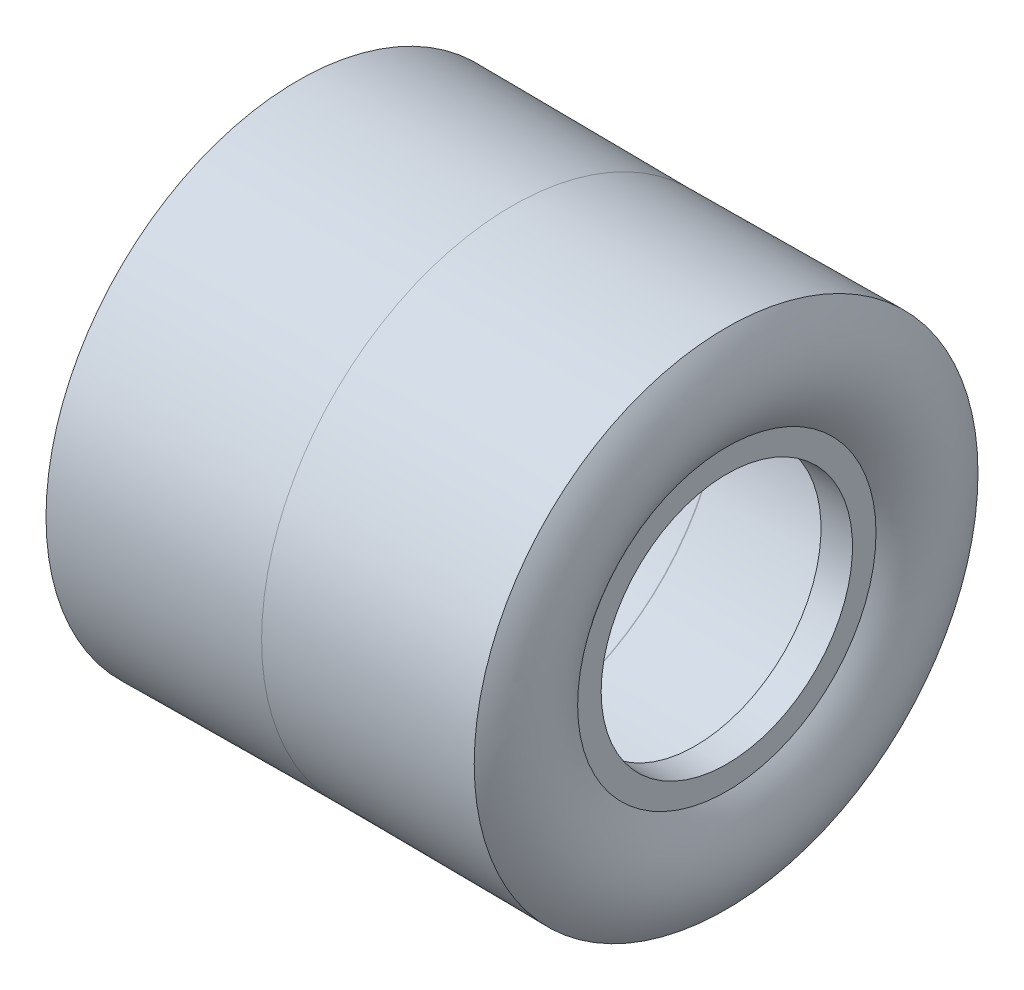
ISO-10303-21;
HEADER;
FILE_DESCRIPTION(('STEP AP214'),'2;1');
FILE_NAME('part.step','',(''),(''),'','','');
FILE_SCHEMA(('AUTOMOTIVE_DESIGN { 1 0 10303 214 1 1 1 1 }'));
ENDSEC;
DATA;
#1=APPLICATION_CONTEXT('core data for automotive mechanical design processes');
#2=APPLICATION_PROTOCOL_DEFINITION('international standard','automotive_design',2000,#1);
#3=PRODUCT_CONTEXT('',#1,'mechanical');
#4=PRODUCT('Part','Part','',(#3));
#5=PRODUCT_RELATED_PRODUCT_CATEGORY('part','',(#4));
#6=PRODUCT_DEFINITION_FORMATION('','',#4);
#7=PRODUCT_DEFINITION_CONTEXT('part definition',#1,'design');
#8=PRODUCT_DEFINITION('design','',#6,#7);
#9=PRODUCT_DEFINITION_SHAPE('','',#8);
#10=(LENGTH_UNIT() NAMED_UNIT(*) SI_UNIT(.MILLI.,.METRE.));
#11=(NAMED_UNIT(*) PLANE_ANGLE_UNIT() SI_UNIT($,.RADIAN.));
#12=(NAMED_UNIT(*) SI_UNIT($,.STERADIAN.) SOLID_ANGLE_UNIT());
#13=UNCERTAINTY_MEASURE_WITH_UNIT(LENGTH_MEASURE(1.E-05),#10,'distance_accuracy_value','');
#14=(GEOMETRIC_REPRESENTATION_CONTEXT(3) GLOBAL_UNCERTAINTY_ASSIGNED_CONTEXT((#13)) GLOBAL_UNIT_ASSIGNED_CONTEXT((#10,
#11,#12)) REPRESENTATION_CONTEXT('',''));
#15=CARTESIAN_POINT('',(0.,0.,0.));
#16=DIRECTION('',(0.,0.,1.));
#17=DIRECTION('',(1.,0.,0.));
#18=AXIS2_PLACEMENT_3D('',#15,#16,#17);
#19=CARTESIAN_POINT('',(68.2287456718073,47.3816427715572,0.));
#20=CARTESIAN_POINT('',(80.3874470158296,63.2272067333203,0.));
#21=CARTESIAN_POINT('',(68.,80.,0.));
#22=B_SPLINE_CURVE_WITH_KNOTS('',2,(#19,#20,#21),.UNSPECIFIED.,.F.,.F.,(3,3),(0.,1.),.UNSPECIFIED.);
#23=CARTESIAN_POINT('',(-69.9171390926471,0.,0.));
#24=DIRECTION('',(-1.,0.,0.));
#25=AXIS1_PLACEMENT('',#23,#24);
#26=SURFACE_OF_REVOLUTION('',#22,#25);
#27=CARTESIAN_POINT('',(68.,0.,0.));
#28=DIRECTION('',(-1.,0.,0.));
#29=DIRECTION('',(0.,0.,1.));
#30=AXIS2_PLACEMENT_3D('',#27,#28,#29);
#31=CIRCLE('',#30,80.);
#32=CARTESIAN_POINT('',(68.,0.,80.));
#33=VERTEX_POINT('',#32);
#34=EDGE_CURVE('E10',#33,#33,#31,.T.);
#35=ORIENTED_EDGE('',*,*,#34,.F.);
#36=EDGE_LOOP('',(#35));
#37=FACE_BOUND('',#36,.T.);
#38=CARTESIAN_POINT('',(68.2287456718073,0.,0.));
#39=DIRECTION('',(-1.,0.,0.));
#40=DIRECTION('',(0.,0.,1.));
#41=AXIS2_PLACEMENT_3D('',#38,#39,#40);
#42=CIRCLE('',#41,47.3816427715572);
#43=CARTESIAN_POINT('',(68.2287456718073,0.,47.3816427715572));
#44=VERTEX_POINT('',#43);
#45=EDGE_CURVE('E87',#44,#44,#42,.T.);
#46=ORIENTED_EDGE('',*,*,#45,.T.);
#47=EDGE_LOOP('',(#46));
#48=FACE_BOUND('',#47,.T.);
#49=ADVANCED_FACE('F31',(#37,#48),#26,.T.);
#50=CARTESIAN_POINT('',(68.,0.,0.));
#51=DIRECTION('',(1.,0.,0.));
#52=DIRECTION('',(0.,0.,-1.));
#53=AXIS2_PLACEMENT_3D('',#50,#51,#52);
#54=CONICAL_SURFACE('',#53,80.,0.00701267450324491);
#55=CARTESIAN_POINT('',(0.,0.,0.));
#56=DIRECTION('',(-1.,0.,0.));
#57=DIRECTION('',(0.,0.,1.));
#58=AXIS2_PLACEMENT_3D('',#55,#56,#57);
#59=CIRCLE('',#58,79.5231303166509);
#60=CARTESIAN_POINT('',(0.,0.,79.5231303166509));
#61=VERTEX_POINT('',#60);
#62=EDGE_CURVE('E38',#61,#61,#59,.T.);
#63=ORIENTED_EDGE('',*,*,#62,.F.);
#64=EDGE_LOOP('',(#63));
#65=FACE_BOUND('',#64,.T.);
#66=ORIENTED_EDGE('',*,*,#34,.T.);
#67=EDGE_LOOP('',(#66));
#68=FACE_BOUND('',#67,.T.);
#69=ADVANCED_FACE('F163',(#65,#68),#54,.T.);
#70=CARTESIAN_POINT('',(0.,0.,0.));
#71=DIRECTION('',(-1.,0.,0.));
#72=DIRECTION('',(0.,0.,1.));
#73=AXIS2_PLACEMENT_3D('',#70,#71,#72);
#74=CONICAL_SURFACE('',#73,79.5231303166509,0.00701267450324491);
#75=CARTESIAN_POINT('',(-68.,0.,0.));
#76=DIRECTION('',(-1.,0.,0.));
#77=DIRECTION('',(0.,0.,1.));
#78=AXIS2_PLACEMENT_3D('',#75,#76,#77);
#79=CIRCLE('',#78,80.);
#80=CARTESIAN_POINT('',(-68.,0.,80.));
#81=VERTEX_POINT('',#80);
#82=EDGE_CURVE('E42',#81,#81,#79,.T.);
#83=ORIENTED_EDGE('',*,*,#82,.F.);
#84=EDGE_LOOP('',(#83));
#85=FACE_BOUND('',#84,.T.);
#86=ORIENTED_EDGE('',*,*,#62,.T.);
#87=EDGE_LOOP('',(#86));
#88=FACE_BOUND('',#87,.T.);
#89=ADVANCED_FACE('F148',(#85,#88),#74,.T.);
#90=CARTESIAN_POINT('',(-68.,80.,0.));
#91=CARTESIAN_POINT('',(-80.3874470158296,63.2272067333203,0.));
#92=CARTESIAN_POINT('',(-68.2287456718073,47.3816427715572,0.));
#93=B_SPLINE_CURVE_WITH_KNOTS('',2,(#90,#91,#92),.UNSPECIFIED.,.F.,.F.,(3,3),(0.,1.),.UNSPECIFIED.);
#94=CARTESIAN_POINT('',(-69.9171390926471,0.,0.));
#95=DIRECTION('',(-1.,0.,0.));
#96=AXIS1_PLACEMENT('',#94,#95);
#97=SURFACE_OF_REVOLUTION('',#93,#96);
#98=CARTESIAN_POINT('',(-68.2287456718073,0.,0.));
#99=DIRECTION('',(-1.,0.,0.));
#100=DIRECTION('',(0.,0.,1.));
#101=AXIS2_PLACEMENT_3D('',#98,#99,#100);
#102=CIRCLE('',#101,47.3816427715572);
#103=CARTESIAN_POINT('',(-68.2287456718073,0.,47.3816427715572));
#104=VERTEX_POINT('',#103);
#105=EDGE_CURVE('E46',#104,#104,#102,.T.);
#106=ORIENTED_EDGE('',*,*,#105,.F.);
#107=EDGE_LOOP('',(#106));
#108=FACE_BOUND('',#107,.T.);
#109=ORIENTED_EDGE('',*,*,#82,.T.);
#110=EDGE_LOOP('',(#109));
#111=FACE_BOUND('',#110,.T.);
#112=ADVANCED_FACE('F144',(#108,#111),#97,.T.);
#113=CARTESIAN_POINT('',(-68.2287456718073,47.3816427715572,0.));
#114=DIRECTION('',(1.,0.,0.));
#115=DIRECTION('',(0.,0.,-1.));
#116=AXIS2_PLACEMENT_3D('',#113,#114,#115);
#117=PLANE('',#116);
#118=CARTESIAN_POINT('',(-68.2287456718073,0.,0.));
#119=DIRECTION('',(-1.,0.,0.));
#120=DIRECTION('',(0.,0.,1.));
#121=AXIS2_PLACEMENT_3D('',#118,#119,#120);
#122=CIRCLE('',#121,39.9147935716869);
#123=CARTESIAN_POINT('',(-68.2287456718073,0.,39.9147935716869));
#124=VERTEX_POINT('',#123);
#125=EDGE_CURVE('E51',#124,#124,#122,.T.);
#126=ORIENTED_EDGE('',*,*,#125,.F.);
#127=EDGE_LOOP('',(#126));
#128=FACE_BOUND('',#127,.T.);
#129=ORIENTED_EDGE('',*,*,#105,.T.);
#130=EDGE_LOOP('',(#129));
#131=FACE_BOUND('',#130,.T.);
#132=ADVANCED_FACE('F140',(#128,#131),#117,.F.);
#133=CARTESIAN_POINT('',(-69.9171390926471,0.,0.));
#134=DIRECTION('',(-1.,0.,0.));
#135=DIRECTION('',(0.,0.,1.));
#136=AXIS2_PLACEMENT_3D('',#133,#134,#135);
#137=CYLINDRICAL_SURFACE('',#136,39.9147935716869);
#138=CARTESIAN_POINT('',(-58.2287456718073,0.,0.));
#139=DIRECTION('',(-1.,0.,0.));
#140=DIRECTION('',(0.,0.,1.));
#141=AXIS2_PLACEMENT_3D('',#138,#139,#140);
#142=CIRCLE('',#141,39.9147935716869);
#143=CARTESIAN_POINT('',(-58.2287456718073,0.,39.9147935716869));
#144=VERTEX_POINT('',#143);
#145=EDGE_CURVE('E54',#144,#144,#142,.T.);
#146=ORIENTED_EDGE('',*,*,#145,.F.);
#147=EDGE_LOOP('',(#146));
#148=FACE_BOUND('',#147,.T.);
#149=ORIENTED_EDGE('',*,*,#125,.T.);
#150=EDGE_LOOP('',(#149));
#151=FACE_BOUND('',#150,.T.);
#152=ADVANCED_FACE('F136',(#148,#151),#137,.F.);
#153=CARTESIAN_POINT('',(-58.2287456718073,50.7761792639091,0.));
#154=DIRECTION('',(-1.,0.,0.));
#155=DIRECTION('',(0.,0.,1.));
#156=AXIS2_PLACEMENT_3D('',#153,#154,#155);
#157=PLANE('',#156);
#158=CARTESIAN_POINT('',(-58.2287456718073,0.,0.));
#159=DIRECTION('',(-1.,0.,0.));
#160=DIRECTION('',(0.,0.,1.));
#161=AXIS2_PLACEMENT_3D('',#158,#159,#160);
#162=CIRCLE('',#161,50.7761792639091);
#163=CARTESIAN_POINT('',(-58.2287456718073,0.,50.7761792639091));
#164=VERTEX_POINT('',#163);
#165=EDGE_CURVE('E57',#164,#164,#162,.T.);
#166=ORIENTED_EDGE('',*,*,#165,.F.);
#167=EDGE_LOOP('',(#166));
#168=FACE_BOUND('',#167,.T.);
#169=ORIENTED_EDGE('',*,*,#145,.T.);
#170=EDGE_LOOP('',(#169));
#171=FACE_BOUND('',#170,.T.);
#172=ADVANCED_FACE('F132',(#168,#171),#157,.F.);
#173=CARTESIAN_POINT('',(-58.2287456718071,50.7761792639092,0.));
#174=CARTESIAN_POINT('',(-58.9476001395902,51.2464834483122,0.));
#175=CARTESIAN_POINT('',(-60.0275461153251,51.9529484494856,0.));
#176=CARTESIAN_POINT('',(-60.624280013394,52.3434675968088,0.));
#177=CARTESIAN_POINT('',(-61.1167072381717,52.6649987959578,0.));
#178=CARTESIAN_POINT('',(-61.4475279637822,52.8852316104484,0.));
#179=CARTESIAN_POINT('',(-61.8797880597663,53.1824239595001,0.));
#180=CARTESIAN_POINT('',(-62.4494628677081,53.5935921717072,0.));
#181=CARTESIAN_POINT('',(-63.2138920110062,54.182380482201,0.));
#182=CARTESIAN_POINT('',(-64.4522473331138,55.23813410515,0.));
#183=CARTESIAN_POINT('',(-65.9796081472432,56.8551965008121,0.));
#184=CARTESIAN_POINT('',(-67.2140638515878,58.6598642210439,0.));
#185=CARTESIAN_POINT('',(-68.0561016594595,60.4838787723582,0.));
#186=CARTESIAN_POINT('',(-68.5864545796832,62.4575790602017,0.));
#187=CARTESIAN_POINT('',(-68.7231538542693,63.875719569985,0.));
#188=CARTESIAN_POINT('',(-68.773671261139,64.7607734414299,0.));
#189=CARTESIAN_POINT('',(-68.74914709552,66.0506806042614,0.));
#190=CARTESIAN_POINT('',(-68.6525435424612,67.1037583075277,0.));
#191=CARTESIAN_POINT('',(-68.6064006328113,67.4688591487582,0.));
#192=B_SPLINE_CURVE_WITH_KNOTS('',2,(#173,#174,#175,#176,#177,#178,#179,#180,#181,#182,#183,
#184,#185,#186,#187,#188,#189,#190,#191),.UNSPECIFIED.,.F.,.F.,(3,1,1,1,1,1,1,1,1,1,1,1,1,1,1,1,
1,3),(0.166970864005427,0.210002478761297,0.231518286139231,0.245862157724521,0.260206029309811,
0.2745499008951,0.296065708273035,0.324753451443614,0.367785066199483,0.453848295711222,
0.56859926839354,0.683350241075857,0.798101213758175,0.912852186440493,0.941135155493075,
0.998510641834234,1.05615597758739,1.08497864546397),.UNSPECIFIED.);
#193=CARTESIAN_POINT('',(-69.9171390926471,0.,0.));
#194=DIRECTION('',(-1.,0.,0.));
#195=AXIS1_PLACEMENT('',#193,#194);
#196=SURFACE_OF_REVOLUTION('',#192,#195);
#197=CARTESIAN_POINT('',(-68.6064006328113,0.,0.));
#198=DIRECTION('',(-1.,0.,0.));
#199=DIRECTION('',(0.,0.,1.));
#200=AXIS2_PLACEMENT_3D('',#197,#198,#199);
#201=CIRCLE('',#200,67.4688591487582);
#202=CARTESIAN_POINT('',(-68.6064006328113,0.,67.4688591487582));
#203=VERTEX_POINT('',#202);
#204=EDGE_CURVE('E60',#203,#203,#201,.T.);
#205=ORIENTED_EDGE('',*,*,#204,.F.);
#206=EDGE_LOOP('',(#205));
#207=FACE_BOUND('',#206,.T.);
#208=ORIENTED_EDGE('',*,*,#165,.T.);
#209=EDGE_LOOP('',(#208));
#210=FACE_BOUND('',#209,.T.);
#211=ADVANCED_FACE('F128',(#207,#210),#196,.T.);
#212=CARTESIAN_POINT('',(-69.9171390926471,0.,0.));
#213=DIRECTION('',(-1.,0.,0.));
#214=DIRECTION('',(0.,0.,1.));
#215=AXIS2_PLACEMENT_3D('',#212,#213,#214);
#216=CYLINDRICAL_SURFACE('',#215,67.4688591487582);
#217=CARTESIAN_POINT('',(-62.5212527649741,0.,0.));
#218=DIRECTION('',(-1.,0.,0.));
#219=DIRECTION('',(0.,0.,1.));
#220=AXIS2_PLACEMENT_3D('',#217,#218,#219);
#221=CIRCLE('',#220,67.4688591487582);
#222=CARTESIAN_POINT('',(-62.5212527649741,0.,67.4688591487582));
#223=VERTEX_POINT('',#222);
#224=EDGE_CURVE('E63',#223,#223,#221,.T.);
#225=ORIENTED_EDGE('',*,*,#224,.F.);
#226=EDGE_LOOP('',(#225));
#227=FACE_BOUND('',#226,.T.);
#228=ORIENTED_EDGE('',*,*,#204,.T.);
#229=EDGE_LOOP('',(#228));
#230=FACE_BOUND('',#229,.T.);
#231=ADVANCED_FACE('F124',(#227,#230),#216,.F.);
#232=CARTESIAN_POINT('',(-62.5212527649741,0.,0.));
#233=DIRECTION('',(-1.,0.,0.));
#234=DIRECTION('',(0.,0.,1.));
#235=AXIS2_PLACEMENT_3D('',#232,#233,#234);
#236=CONICAL_SURFACE('',#235,67.4688591487582,0.00701267450324476);
#237=CARTESIAN_POINT('',(-0.0876045036814765,0.,0.));
#238=DIRECTION('',(-1.,0.,0.));
#239=DIRECTION('',(0.,0.,1.));
#240=AXIS2_PLACEMENT_3D('',#237,#238,#239);
#241=CIRCLE('',#240,67.0310251182187);
#242=CARTESIAN_POINT('',(-0.0876045036814765,0.,67.0310251182187));
#243=VERTEX_POINT('',#242);
#244=EDGE_CURVE('E66',#243,#243,#241,.T.);
#245=ORIENTED_EDGE('',*,*,#244,.F.);
#246=EDGE_LOOP('',(#245));
#247=FACE_BOUND('',#246,.T.);
#248=ORIENTED_EDGE('',*,*,#224,.T.);
#249=EDGE_LOOP('',(#248));
#250=FACE_BOUND('',#249,.T.);
#251=ADVANCED_FACE('F120',(#247,#250),#236,.F.);
#252=CARTESIAN_POINT('',(-69.9171390926471,0.,0.));
#253=DIRECTION('',(-1.,0.,0.));
#254=DIRECTION('',(0.,0.,1.));
#255=AXIS2_PLACEMENT_3D('',#252,#253,#254);
#256=CYLINDRICAL_SURFACE('',#255,67.0310251182187);
#257=CARTESIAN_POINT('',(0.0876045036814765,0.,0.));
#258=DIRECTION('',(-1.,0.,0.));
#259=DIRECTION('',(0.,0.,1.));
#260=AXIS2_PLACEMENT_3D('',#257,#258,#259);
#261=CIRCLE('',#260,67.0310251182187);
#262=CARTESIAN_POINT('',(0.0876045036814765,0.,67.0310251182187));
#263=VERTEX_POINT('',#262);
#264=EDGE_CURVE('E69',#263,#263,#261,.T.);
#265=ORIENTED_EDGE('',*,*,#264,.F.);
#266=EDGE_LOOP('',(#265));
#267=FACE_BOUND('',#266,.T.);
#268=ORIENTED_EDGE('',*,*,#244,.T.);
#269=EDGE_LOOP('',(#268));
#270=FACE_BOUND('',#269,.T.);
#271=ADVANCED_FACE('F116',(#267,#270),#256,.F.);
#272=CARTESIAN_POINT('',(0.0876045036814765,0.,0.));
#273=DIRECTION('',(1.,0.,0.));
#274=DIRECTION('',(0.,0.,-1.));
#275=AXIS2_PLACEMENT_3D('',#272,#273,#274);
#276=CONICAL_SURFACE('',#275,67.0310251182187,0.00701267450324476);
#277=CARTESIAN_POINT('',(62.5212527649741,0.,0.));
#278=DIRECTION('',(-1.,0.,0.));
#279=DIRECTION('',(0.,0.,1.));
#280=AXIS2_PLACEMENT_3D('',#277,#278,#279);
#281=CIRCLE('',#280,67.4688591487582);
#282=CARTESIAN_POINT('',(62.5212527649741,0.,67.4688591487582));
#283=VERTEX_POINT('',#282);
#284=EDGE_CURVE('E72',#283,#283,#281,.T.);
#285=ORIENTED_EDGE('',*,*,#284,.F.);
#286=EDGE_LOOP('',(#285));
#287=FACE_BOUND('',#286,.T.);
#288=ORIENTED_EDGE('',*,*,#264,.T.);
#289=EDGE_LOOP('',(#288));
#290=FACE_BOUND('',#289,.T.);
#291=ADVANCED_FACE('F112',(#287,#290),#276,.F.);
#292=CARTESIAN_POINT('',(-69.9171390926471,0.,0.));
#293=DIRECTION('',(-1.,0.,0.));
#294=DIRECTION('',(0.,0.,1.));
#295=AXIS2_PLACEMENT_3D('',#292,#293,#294);
#296=CYLINDRICAL_SURFACE('',#295,67.4688591487582);
#297=CARTESIAN_POINT('',(68.6064006328113,0.,0.));
#298=DIRECTION('',(-1.,0.,0.));
#299=DIRECTION('',(0.,0.,1.));
#300=AXIS2_PLACEMENT_3D('',#297,#298,#299);
#301=CIRCLE('',#300,67.4688591487582);
#302=CARTESIAN_POINT('',(68.6064006328113,0.,67.4688591487582));
#303=VERTEX_POINT('',#302);
#304=EDGE_CURVE('E75',#303,#303,#301,.T.);
#305=ORIENTED_EDGE('',*,*,#304,.F.);
#306=EDGE_LOOP('',(#305));
#307=FACE_BOUND('',#306,.T.);
#308=ORIENTED_EDGE('',*,*,#284,.T.);
#309=EDGE_LOOP('',(#308));
#310=FACE_BOUND('',#309,.T.);
#311=ADVANCED_FACE('F107',(#307,#310),#296,.F.);
#312=CARTESIAN_POINT('',(67.9053844543484,72.0372855428778,0.));
#313=CARTESIAN_POINT('',(68.543185802345,69.5189994459313,0.));
#314=CARTESIAN_POINT('',(68.6477384526338,66.1285841786153,0.));
#315=CARTESIAN_POINT('',(68.3256992715186,63.7208080624987,0.));
#316=CARTESIAN_POINT('',(67.6122117452293,61.4423540529631,0.));
#317=CARTESIAN_POINT('',(66.4334839796339,59.126557732232,0.));
#318=CARTESIAN_POINT('',(64.8808111258963,56.9870672433167,0.));
#319=CARTESIAN_POINT('',(63.5828712673909,55.5533279276876,0.));
#320=CARTESIAN_POINT('',(62.7720334704971,54.7424467070797,0.));
#321=CARTESIAN_POINT('',(62.1635485866198,54.1706990902682,0.));
#322=CARTESIAN_POINT('',(61.6995762714194,53.7543035233361,0.));
#323=CARTESIAN_POINT('',(61.3433811077619,53.4441297732279,0.));
#324=CARTESIAN_POINT('',(60.8122222523506,52.989843702962,0.));
#325=CARTESIAN_POINT('',(60.1686872855266,52.4382920875909,0.));
#326=CARTESIAN_POINT('',(59.003999474979,51.4404470015701,0.));
#327=CARTESIAN_POINT('',(58.2287456718073,50.7761792639091,0.));
#328=B_SPLINE_CURVE_WITH_KNOTS('',2,(#312,#313,#314,#315,#316,#317,#318,#319,#320,#321,#322,
#323,#324,#325,#326,#327),.UNSPECIFIED.,.F.,.F.,(3,1,1,1,1,1,1,1,1,1,1,1,1,1,3),
(0.166970864005427,0.339097323028904,0.453848295711222,0.56859926839354,0.683350241075857,
0.798101213758175,0.884164443269914,0.927196058025783,0.955883801196362,0.977399608574297,
0.991743480159586,1.00608735174488,1.02043122333017,1.0419470307081,1.08497864546397),.UNSPECIFIED.);
#329=CARTESIAN_POINT('',(-69.9171390926471,0.,0.));
#330=DIRECTION('',(-1.,0.,0.));
#331=AXIS1_PLACEMENT('',#329,#330);
#332=SURFACE_OF_REVOLUTION('',#328,#331);
#333=CARTESIAN_POINT('',(58.2287456718073,0.,0.));
#334=DIRECTION('',(-1.,0.,0.));
#335=DIRECTION('',(0.,0.,1.));
#336=AXIS2_PLACEMENT_3D('',#333,#334,#335);
#337=CIRCLE('',#336,50.7761792639091);
#338=CARTESIAN_POINT('',(58.2287456718073,0.,50.7761792639091));
#339=VERTEX_POINT('',#338);
#340=EDGE_CURVE('E78',#339,#339,#337,.T.);
#341=ORIENTED_EDGE('',*,*,#340,.F.);
#342=EDGE_LOOP('',(#341));
#343=FACE_BOUND('',#342,.T.);
#344=ORIENTED_EDGE('',*,*,#304,.T.);
#345=EDGE_LOOP('',(#344));
#346=FACE_BOUND('',#345,.T.);
#347=ADVANCED_FACE('F102',(#343,#346),#332,.T.);
#348=CARTESIAN_POINT('',(58.2287456718073,50.7761792639091,0.));
#349=DIRECTION('',(1.,0.,0.));
#350=DIRECTION('',(0.,0.,-1.));
#351=AXIS2_PLACEMENT_3D('',#348,#349,#350);
#352=PLANE('',#351);
#353=CARTESIAN_POINT('',(58.2287456718073,0.,0.));
#354=DIRECTION('',(-1.,0.,0.));
#355=DIRECTION('',(0.,0.,1.));
#356=AXIS2_PLACEMENT_3D('',#353,#354,#355);
#357=CIRCLE('',#356,39.9147935716869);
#358=CARTESIAN_POINT('',(58.2287456718073,0.,39.9147935716869));
#359=VERTEX_POINT('',#358);
#360=EDGE_CURVE('E81',#359,#359,#357,.T.);
#361=ORIENTED_EDGE('',*,*,#360,.F.);
#362=EDGE_LOOP('',(#361));
#363=FACE_BOUND('',#362,.T.);
#364=ORIENTED_EDGE('',*,*,#340,.T.);
#365=EDGE_LOOP('',(#364));
#366=FACE_BOUND('',#365,.T.);
#367=ADVANCED_FACE('F106',(#363,#366),#352,.F.);
#368=CARTESIAN_POINT('',(-69.9171390926471,0.,0.));
#369=DIRECTION('',(-1.,0.,0.));
#370=DIRECTION('',(0.,0.,1.));
#371=AXIS2_PLACEMENT_3D('',#368,#369,#370);
#372=CYLINDRICAL_SURFACE('',#371,39.9147935716869);
#373=CARTESIAN_POINT('',(68.2287456718073,0.,0.));
#374=DIRECTION('',(-1.,0.,0.));
#375=DIRECTION('',(0.,0.,1.));
#376=AXIS2_PLACEMENT_3D('',#373,#374,#375);
#377=CIRCLE('',#376,39.9147935716869);
#378=CARTESIAN_POINT('',(68.2287456718073,0.,39.9147935716869));
#379=VERTEX_POINT('',#378);
#380=EDGE_CURVE('E84',#379,#379,#377,.T.);
#381=ORIENTED_EDGE('',*,*,#380,.F.);
#382=EDGE_LOOP('',(#381));
#383=FACE_BOUND('',#382,.T.);
#384=ORIENTED_EDGE('',*,*,#360,.T.);
#385=EDGE_LOOP('',(#384));
#386=FACE_BOUND('',#385,.T.);
#387=ADVANCED_FACE('F179',(#383,#386),#372,.F.);
#388=CARTESIAN_POINT('',(68.2287456718073,47.3816427715572,0.));
#389=DIRECTION('',(-1.,0.,0.));
#390=DIRECTION('',(0.,0.,1.));
#391=AXIS2_PLACEMENT_3D('',#388,#389,#390);
#392=PLANE('',#391);
#393=ORIENTED_EDGE('',*,*,#45,.F.);
#394=EDGE_LOOP('',(#393));
#395=FACE_BOUND('',#394,.T.);
#396=ORIENTED_EDGE('',*,*,#380,.T.);
#397=EDGE_LOOP('',(#396));
#398=FACE_BOUND('',#397,.T.);
#399=ADVANCED_FACE('F176',(#395,#398),#392,.F.);
#400=CLOSED_SHELL('',(#49,#69,#89,#112,#132,#152,#172,#211,#231,#251,#271,#291,#311,#347,#367,
#387,#399));
#401=MANIFOLD_SOLID_BREP('B2',#400);
#402=ADVANCED_BREP_SHAPE_REPRESENTATION('',(#18,#401),#14);
#403=SHAPE_DEFINITION_REPRESENTATION(#9,#402);
ENDSEC;
END-ISO-10303-21;
